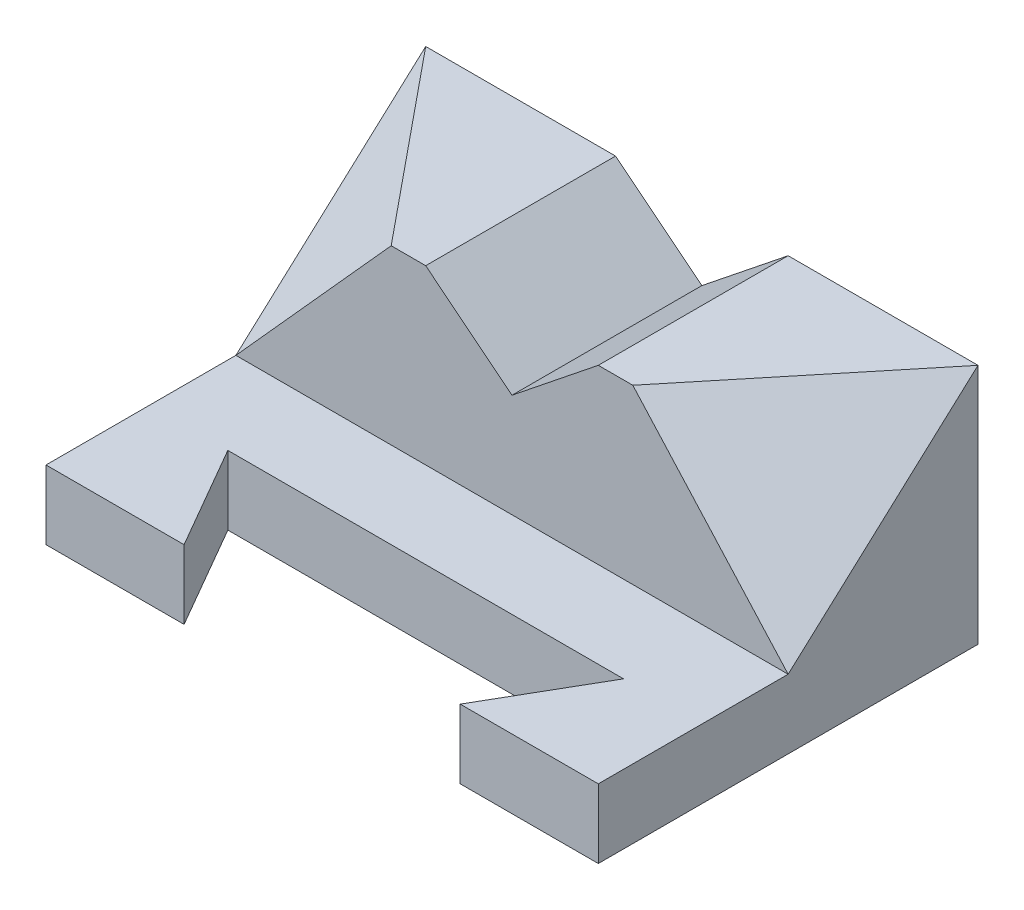
ISO-10303-21;
HEADER;
FILE_DESCRIPTION(('STEP AP214'),'2;1');
FILE_NAME('part.step','',(''),(''),'','','');
FILE_SCHEMA(('AUTOMOTIVE_DESIGN { 1 0 10303 214 1 1 1 1 }'));
ENDSEC;
DATA;
#1=APPLICATION_CONTEXT('core data for automotive mechanical design processes');
#2=APPLICATION_PROTOCOL_DEFINITION('international standard','automotive_design',2000,#1);
#3=PRODUCT_CONTEXT('',#1,'mechanical');
#4=PRODUCT('Part','Part','',(#3));
#5=PRODUCT_RELATED_PRODUCT_CATEGORY('part','',(#4));
#6=PRODUCT_DEFINITION_FORMATION('','',#4);
#7=PRODUCT_DEFINITION_CONTEXT('part definition',#1,'design');
#8=PRODUCT_DEFINITION('design','',#6,#7);
#9=PRODUCT_DEFINITION_SHAPE('','',#8);
#10=(LENGTH_UNIT() NAMED_UNIT(*) SI_UNIT(.MILLI.,.METRE.));
#11=(NAMED_UNIT(*) PLANE_ANGLE_UNIT() SI_UNIT($,.RADIAN.));
#12=(NAMED_UNIT(*) SI_UNIT($,.STERADIAN.) SOLID_ANGLE_UNIT());
#13=UNCERTAINTY_MEASURE_WITH_UNIT(LENGTH_MEASURE(1.E-05),#10,'distance_accuracy_value','');
#14=(GEOMETRIC_REPRESENTATION_CONTEXT(3) GLOBAL_UNCERTAINTY_ASSIGNED_CONTEXT((#13)) GLOBAL_UNIT_ASSIGNED_CONTEXT((#10,
#11,#12)) REPRESENTATION_CONTEXT('',''));
#15=CARTESIAN_POINT('',(0.,0.,0.));
#16=DIRECTION('',(0.,0.,1.));
#17=DIRECTION('',(1.,0.,0.));
#18=AXIS2_PLACEMENT_3D('',#15,#16,#17);
#19=CARTESIAN_POINT('',(-32.,28.,0.));
#20=DIRECTION('',(0.,0.,-1.));
#21=DIRECTION('',(-1.,0.,0.));
#22=AXIS2_PLACEMENT_3D('',#19,#20,#21);
#23=PLANE('',#22);
#24=DIRECTION('',(-0.66896473162245,-0.743294146247166,0.));
#25=VECTOR('',#24,1.);
#26=CARTESIAN_POINT('',(-14.,28.,0.));
#27=LINE('',#26,#25);
#28=CARTESIAN_POINT('',(-14.,28.,0.));
#29=VERTEX_POINT('',#28);
#30=CARTESIAN_POINT('',(-32.,8.,0.));
#31=VERTEX_POINT('',#30);
#32=EDGE_CURVE('E195',#29,#31,#27,.T.);
#33=ORIENTED_EDGE('',*,*,#32,.T.);
#34=DIRECTION('',(1.,0.,0.));
#35=VECTOR('',#34,1.);
#36=CARTESIAN_POINT('',(-32.,8.,0.));
#37=LINE('',#36,#35);
#38=CARTESIAN_POINT('',(32.,8.,0.));
#39=VERTEX_POINT('',#38);
#40=EDGE_CURVE('E222',#31,#39,#37,.T.);
#41=ORIENTED_EDGE('',*,*,#40,.T.);
#42=DIRECTION('',(0.66896473162245,-0.743294146247166,0.));
#43=VECTOR('',#42,1.);
#44=CARTESIAN_POINT('',(14.,28.,0.));
#45=LINE('',#44,#43);
#46=CARTESIAN_POINT('',(14.,28.,0.));
#47=VERTEX_POINT('',#46);
#48=EDGE_CURVE('E298',#47,#39,#45,.T.);
#49=ORIENTED_EDGE('',*,*,#48,.F.);
#50=DIRECTION('',(1.,0.,0.));
#51=VECTOR('',#50,1.);
#52=CARTESIAN_POINT('',(-32.,28.,0.));
#53=LINE('',#52,#51);
#54=CARTESIAN_POINT('',(10.,28.,0.));
#55=VERTEX_POINT('',#54);
#56=EDGE_CURVE('E215',#55,#47,#53,.T.);
#57=ORIENTED_EDGE('',*,*,#56,.F.);
#58=DIRECTION('',(-0.78086880944303,-0.624695047554424,0.));
#59=VECTOR('',#58,1.);
#60=CARTESIAN_POINT('',(-15.609756097561,7.51219512195121,0.));
#61=LINE('',#60,#59);
#62=CARTESIAN_POINT('',(0.,20.,0.));
#63=VERTEX_POINT('',#62);
#64=EDGE_CURVE('E12',#55,#63,#61,.T.);
#65=ORIENTED_EDGE('',*,*,#64,.T.);
#66=DIRECTION('',(-0.78086880944303,0.624695047554424,0.));
#67=VECTOR('',#66,1.);
#68=CARTESIAN_POINT('',(-23.4146341463415,38.7317073170732,0.));
#69=LINE('',#68,#67);
#70=CARTESIAN_POINT('',(-10.,28.,0.));
#71=VERTEX_POINT('',#70);
#72=EDGE_CURVE('E105',#63,#71,#69,.T.);
#73=ORIENTED_EDGE('',*,*,#72,.T.);
#74=EDGE_CURVE('E113',#29,#71,#53,.T.);
#75=ORIENTED_EDGE('',*,*,#74,.F.);
#76=EDGE_LOOP('',(#33,#41,#49,#57,#65,#73,#75));
#77=FACE_BOUND('',#76,.T.);
#78=ADVANCED_FACE('F95',(#77),#23,.F.);
#79=CARTESIAN_POINT('',(0.,28.,0.));
#80=DIRECTION('',(0.,1.,0.));
#81=DIRECTION('',(0.,0.,1.));
#82=AXIS2_PLACEMENT_3D('',#79,#80,#81);
#83=PLANE('',#82);
#84=DIRECTION('',(0.633237790257262,0.,0.773957299203322));
#85=VECTOR('',#84,1.);
#86=CARTESIAN_POINT('',(-32.,28.,-22.));
#87=LINE('',#86,#85);
#88=CARTESIAN_POINT('',(-32.,28.,-22.));
#89=VERTEX_POINT('',#88);
#90=EDGE_CURVE('E197',#89,#29,#87,.T.);
#91=ORIENTED_EDGE('',*,*,#90,.T.);
#92=ORIENTED_EDGE('',*,*,#74,.T.);
#93=DIRECTION('',(0.,0.,-1.));
#94=VECTOR('',#93,1.);
#95=CARTESIAN_POINT('',(-10.,28.,130.698837202751));
#96=LINE('',#95,#94);
#97=CARTESIAN_POINT('',(-10.,28.,-21.9999999999999));
#98=VERTEX_POINT('',#97);
#99=EDGE_CURVE('E297',#71,#98,#96,.T.);
#100=ORIENTED_EDGE('',*,*,#99,.T.);
#101=DIRECTION('',(-1.,0.,0.));
#102=VECTOR('',#101,1.);
#103=CARTESIAN_POINT('',(-32.,28.,-22.));
#104=LINE('',#103,#102);
#105=EDGE_CURVE('E209',#98,#89,#104,.T.);
#106=ORIENTED_EDGE('',*,*,#105,.T.);
#107=EDGE_LOOP('',(#91,#92,#100,#106));
#108=FACE_BOUND('',#107,.T.);
#109=ADVANCED_FACE('F207',(#108),#83,.T.);
#110=CARTESIAN_POINT('',(-32.,8.,22.));
#111=DIRECTION('',(0.,0.,-1.));
#112=DIRECTION('',(-1.,0.,0.));
#113=AXIS2_PLACEMENT_3D('',#110,#111,#112);
#114=PLANE('',#113);
#115=DIRECTION('',(0.,-1.,0.));
#116=VECTOR('',#115,1.);
#117=CARTESIAN_POINT('',(-16.,111.198837202751,22.));
#118=LINE('',#117,#116);
#119=CARTESIAN_POINT('',(-16.,8.,22.));
#120=VERTEX_POINT('',#119);
#121=CARTESIAN_POINT('',(-16.,0.,22.));
#122=VERTEX_POINT('',#121);
#123=EDGE_CURVE('E266',#120,#122,#118,.T.);
#124=ORIENTED_EDGE('',*,*,#123,.F.);
#125=DIRECTION('',(1.,0.,0.));
#126=VECTOR('',#125,1.);
#127=CARTESIAN_POINT('',(-32.,8.,22.));
#128=LINE('',#127,#126);
#129=CARTESIAN_POINT('',(-32.,8.,22.));
#130=VERTEX_POINT('',#129);
#131=EDGE_CURVE('E335',#130,#120,#128,.T.);
#132=ORIENTED_EDGE('',*,*,#131,.F.);
#133=DIRECTION('',(0.,-1.,0.));
#134=VECTOR('',#133,1.);
#135=CARTESIAN_POINT('',(-32.,8.,22.));
#136=LINE('',#135,#134);
#137=CARTESIAN_POINT('',(-32.,0.,22.));
#138=VERTEX_POINT('',#137);
#139=EDGE_CURVE('E330',#130,#138,#136,.T.);
#140=ORIENTED_EDGE('',*,*,#139,.T.);
#141=DIRECTION('',(1.,0.,0.));
#142=VECTOR('',#141,1.);
#143=CARTESIAN_POINT('',(-32.,0.,22.));
#144=LINE('',#143,#142);
#145=EDGE_CURVE('E256',#138,#122,#144,.T.);
#146=ORIENTED_EDGE('',*,*,#145,.T.);
#147=EDGE_LOOP('',(#124,#132,#140,#146));
#148=FACE_BOUND('',#147,.T.);
#149=ADVANCED_FACE('F408',(#148),#114,.F.);
#150=CARTESIAN_POINT('',(0.,8.,0.));
#151=DIRECTION('',(0.,-1.,0.));
#152=DIRECTION('',(0.,0.,-1.));
#153=AXIS2_PLACEMENT_3D('',#150,#151,#152);
#154=PLANE('',#153);
#155=ORIENTED_EDGE('',*,*,#131,.T.);
#156=DIRECTION('',(-0.499999999999998,0.,-0.86602540378444));
#157=VECTOR('',#156,1.);
#158=CARTESIAN_POINT('',(-21.5262794416288,8.,12.4282032302755));
#159=LINE('',#158,#157);
#160=CARTESIAN_POINT('',(-22.9282032302755,8.,10.));
#161=VERTEX_POINT('',#160);
#162=EDGE_CURVE('E121',#120,#161,#159,.T.);
#163=ORIENTED_EDGE('',*,*,#162,.T.);
#164=DIRECTION('',(1.,0.,0.));
#165=VECTOR('',#164,1.);
#166=CARTESIAN_POINT('',(0.,8.,10.));
#167=LINE('',#166,#165);
#168=CARTESIAN_POINT('',(22.9282032302755,8.,10.));
#169=VERTEX_POINT('',#168);
#170=EDGE_CURVE('E261',#161,#169,#167,.T.);
#171=ORIENTED_EDGE('',*,*,#170,.T.);
#172=DIRECTION('',(-0.499999999999998,0.,0.86602540378444));
#173=VECTOR('',#172,1.);
#174=CARTESIAN_POINT('',(21.5262794416288,8.,12.4282032302754));
#175=LINE('',#174,#173);
#176=CARTESIAN_POINT('',(16.,8.,22.));
#177=VERTEX_POINT('',#176);
#178=EDGE_CURVE('E263',#169,#177,#175,.T.);
#179=ORIENTED_EDGE('',*,*,#178,.T.);
#180=CARTESIAN_POINT('',(32.,8.,22.));
#181=VERTEX_POINT('',#180);
#182=EDGE_CURVE('E333',#177,#181,#128,.T.);
#183=ORIENTED_EDGE('',*,*,#182,.T.);
#184=DIRECTION('',(0.,0.,-1.));
#185=VECTOR('',#184,1.);
#186=CARTESIAN_POINT('',(32.,8.,22.));
#187=LINE('',#186,#185);
#188=EDGE_CURVE('E252',#181,#39,#187,.T.);
#189=ORIENTED_EDGE('',*,*,#188,.T.);
#190=ORIENTED_EDGE('',*,*,#40,.F.);
#191=DIRECTION('',(0.,0.,1.));
#192=VECTOR('',#191,1.);
#193=CARTESIAN_POINT('',(-32.,8.,22.));
#194=LINE('',#193,#192);
#195=EDGE_CURVE('E229',#31,#130,#194,.T.);
#196=ORIENTED_EDGE('',*,*,#195,.T.);
#197=EDGE_LOOP('',(#155,#163,#171,#179,#183,#189,#190,#196));
#198=FACE_BOUND('',#197,.T.);
#199=ADVANCED_FACE('F383',(#198),#154,.F.);
#200=CARTESIAN_POINT('',(32.,8.,22.));
#201=DIRECTION('',(-1.,0.,0.));
#202=DIRECTION('',(0.,0.,1.));
#203=AXIS2_PLACEMENT_3D('',#200,#201,#202);
#204=PLANE('',#203);
#205=DIRECTION('',(0.,-1.,0.));
#206=VECTOR('',#205,1.);
#207=CARTESIAN_POINT('',(32.,8.,-22.));
#208=LINE('',#207,#206);
#209=CARTESIAN_POINT('',(32.,28.,-22.));
#210=VERTEX_POINT('',#209);
#211=CARTESIAN_POINT('',(32.,0.,-22.));
#212=VERTEX_POINT('',#211);
#213=EDGE_CURVE('E240',#210,#212,#208,.T.);
#214=ORIENTED_EDGE('',*,*,#213,.F.);
#215=DIRECTION('',(0.,0.672672793996313,-0.739940073395944));
#216=VECTOR('',#215,1.);
#217=CARTESIAN_POINT('',(32.,8.,0.));
#218=LINE('',#217,#216);
#219=EDGE_CURVE('E305',#39,#210,#218,.T.);
#220=ORIENTED_EDGE('',*,*,#219,.F.);
#221=ORIENTED_EDGE('',*,*,#188,.F.);
#222=DIRECTION('',(0.,-1.,0.));
#223=VECTOR('',#222,1.);
#224=CARTESIAN_POINT('',(32.,8.,22.));
#225=LINE('',#224,#223);
#226=CARTESIAN_POINT('',(32.,0.,22.));
#227=VERTEX_POINT('',#226);
#228=EDGE_CURVE('E339',#181,#227,#225,.T.);
#229=ORIENTED_EDGE('',*,*,#228,.T.);
#230=DIRECTION('',(0.,0.,-1.));
#231=VECTOR('',#230,1.);
#232=CARTESIAN_POINT('',(32.,0.,22.));
#233=LINE('',#232,#231);
#234=EDGE_CURVE('E251',#227,#212,#233,.T.);
#235=ORIENTED_EDGE('',*,*,#234,.T.);
#236=EDGE_LOOP('',(#214,#220,#221,#229,#235));
#237=FACE_BOUND('',#236,.T.);
#238=ADVANCED_FACE('F97',(#237),#204,.F.);
#239=CARTESIAN_POINT('',(-32.,8.,-22.));
#240=DIRECTION('',(0.,0.,1.));
#241=DIRECTION('',(1.,0.,0.));
#242=AXIS2_PLACEMENT_3D('',#239,#240,#241);
#243=PLANE('',#242);
#244=DIRECTION('',(0.78086880944303,-0.624695047554424,0.));
#245=VECTOR('',#244,1.);
#246=CARTESIAN_POINT('',(-13.6585365853659,30.9268292682927,-22.));
#247=LINE('',#246,#245);
#248=CARTESIAN_POINT('',(0.,20.,-21.9999999999999));
#249=VERTEX_POINT('',#248);
#250=EDGE_CURVE('E288',#98,#249,#247,.T.);
#251=ORIENTED_EDGE('',*,*,#250,.T.);
#252=DIRECTION('',(0.78086880944303,0.624695047554424,0.));
#253=VECTOR('',#252,1.);
#254=CARTESIAN_POINT('',(-25.3658536585366,-0.292682926829272,-22.));
#255=LINE('',#254,#253);
#256=CARTESIAN_POINT('',(10.,28.,-21.9999999999999));
#257=VERTEX_POINT('',#256);
#258=EDGE_CURVE('E281',#249,#257,#255,.T.);
#259=ORIENTED_EDGE('',*,*,#258,.T.);
#260=EDGE_CURVE('E219',#210,#257,#104,.T.);
#261=ORIENTED_EDGE('',*,*,#260,.F.);
#262=ORIENTED_EDGE('',*,*,#213,.T.);
#263=DIRECTION('',(-1.,0.,0.));
#264=VECTOR('',#263,1.);
#265=CARTESIAN_POINT('',(-32.,0.,-22.));
#266=LINE('',#265,#264);
#267=CARTESIAN_POINT('',(-32.,0.,-22.));
#268=VERTEX_POINT('',#267);
#269=EDGE_CURVE('E344',#212,#268,#266,.T.);
#270=ORIENTED_EDGE('',*,*,#269,.T.);
#271=DIRECTION('',(0.,-1.,0.));
#272=VECTOR('',#271,1.);
#273=CARTESIAN_POINT('',(-32.,8.,-22.));
#274=LINE('',#273,#272);
#275=EDGE_CURVE('E245',#89,#268,#274,.T.);
#276=ORIENTED_EDGE('',*,*,#275,.F.);
#277=ORIENTED_EDGE('',*,*,#105,.F.);
#278=EDGE_LOOP('',(#251,#259,#261,#262,#270,#276,#277));
#279=FACE_BOUND('',#278,.T.);
#280=ADVANCED_FACE('F405',(#279),#243,.F.);
#281=CARTESIAN_POINT('',(-32.,8.,22.));
#282=DIRECTION('',(1.,0.,0.));
#283=DIRECTION('',(0.,0.,-1.));
#284=AXIS2_PLACEMENT_3D('',#281,#282,#283);
#285=PLANE('',#284);
#286=ORIENTED_EDGE('',*,*,#195,.F.);
#287=DIRECTION('',(0.,0.672672793996313,-0.739940073395944));
#288=VECTOR('',#287,1.);
#289=CARTESIAN_POINT('',(-32.,8.,0.));
#290=LINE('',#289,#288);
#291=EDGE_CURVE('E199',#31,#89,#290,.T.);
#292=ORIENTED_EDGE('',*,*,#291,.T.);
#293=ORIENTED_EDGE('',*,*,#275,.T.);
#294=DIRECTION('',(0.,0.,1.));
#295=VECTOR('',#294,1.);
#296=CARTESIAN_POINT('',(-32.,0.,22.));
#297=LINE('',#296,#295);
#298=EDGE_CURVE('E347',#268,#138,#297,.T.);
#299=ORIENTED_EDGE('',*,*,#298,.T.);
#300=ORIENTED_EDGE('',*,*,#139,.F.);
#301=EDGE_LOOP('',(#286,#292,#293,#299,#300));
#302=FACE_BOUND('',#301,.T.);
#303=ADVANCED_FACE('F326',(#302),#285,.F.);
#304=ORIENTED_EDGE('',*,*,#182,.F.);
#305=DIRECTION('',(0.,-1.,0.));
#306=VECTOR('',#305,1.);
#307=CARTESIAN_POINT('',(16.,111.198837202751,22.));
#308=LINE('',#307,#306);
#309=CARTESIAN_POINT('',(16.,0.,22.));
#310=VERTEX_POINT('',#309);
#311=EDGE_CURVE('E273',#177,#310,#308,.T.);
#312=ORIENTED_EDGE('',*,*,#311,.T.);
#313=EDGE_CURVE('E350',#310,#227,#144,.T.);
#314=ORIENTED_EDGE('',*,*,#313,.T.);
#315=ORIENTED_EDGE('',*,*,#228,.F.);
#316=EDGE_LOOP('',(#304,#312,#314,#315));
#317=FACE_BOUND('',#316,.T.);
#318=ADVANCED_FACE('F385',(#317),#114,.F.);
#319=CARTESIAN_POINT('',(0.,0.,0.));
#320=DIRECTION('',(0.,-1.,0.));
#321=DIRECTION('',(0.,0.,-1.));
#322=AXIS2_PLACEMENT_3D('',#319,#320,#321);
#323=PLANE('',#322);
#324=DIRECTION('',(-0.499999999999998,0.,-0.86602540378444));
#325=VECTOR('',#324,1.);
#326=CARTESIAN_POINT('',(-21.5262794416288,0.,12.4282032302755));
#327=LINE('',#326,#325);
#328=CARTESIAN_POINT('',(-22.9282032302755,0.,10.));
#329=VERTEX_POINT('',#328);
#330=EDGE_CURVE('E366',#122,#329,#327,.T.);
#331=ORIENTED_EDGE('',*,*,#330,.F.);
#332=ORIENTED_EDGE('',*,*,#145,.F.);
#333=ORIENTED_EDGE('',*,*,#298,.F.);
#334=ORIENTED_EDGE('',*,*,#269,.F.);
#335=ORIENTED_EDGE('',*,*,#234,.F.);
#336=ORIENTED_EDGE('',*,*,#313,.F.);
#337=DIRECTION('',(-0.499999999999998,0.,0.86602540378444));
#338=VECTOR('',#337,1.);
#339=CARTESIAN_POINT('',(21.5262794416288,0.,12.4282032302754));
#340=LINE('',#339,#338);
#341=CARTESIAN_POINT('',(22.9282032302755,0.,10.));
#342=VERTEX_POINT('',#341);
#343=EDGE_CURVE('E244',#342,#310,#340,.T.);
#344=ORIENTED_EDGE('',*,*,#343,.F.);
#345=DIRECTION('',(1.,0.,0.));
#346=VECTOR('',#345,1.);
#347=CARTESIAN_POINT('',(0.,0.,10.));
#348=LINE('',#347,#346);
#349=EDGE_CURVE('E362',#329,#342,#348,.T.);
#350=ORIENTED_EDGE('',*,*,#349,.F.);
#351=EDGE_LOOP('',(#331,#332,#333,#334,#335,#336,#344,#350));
#352=FACE_BOUND('',#351,.T.);
#353=ADVANCED_FACE('F406',(#352),#323,.T.);
#354=DIRECTION('',(-0.633237790257262,0.,0.773957299203322));
#355=VECTOR('',#354,1.);
#356=CARTESIAN_POINT('',(32.,28.,-22.));
#357=LINE('',#356,#355);
#358=EDGE_CURVE('E204',#210,#47,#357,.T.);
#359=ORIENTED_EDGE('',*,*,#358,.F.);
#360=ORIENTED_EDGE('',*,*,#260,.T.);
#361=DIRECTION('',(0.,0.,-1.));
#362=VECTOR('',#361,1.);
#363=CARTESIAN_POINT('',(10.,28.,130.698837202751));
#364=LINE('',#363,#362);
#365=EDGE_CURVE('E292',#55,#257,#364,.T.);
#366=ORIENTED_EDGE('',*,*,#365,.F.);
#367=ORIENTED_EDGE('',*,*,#56,.T.);
#368=EDGE_LOOP('',(#359,#360,#366,#367));
#369=FACE_BOUND('',#368,.T.);
#370=ADVANCED_FACE('F396',(#369),#83,.T.);
#371=CARTESIAN_POINT('',(-22.9282032302755,111.198837202751,10.));
#372=DIRECTION('',(-0.86602540378444,0.,0.499999999999998));
#373=DIRECTION('',(0.499999999999998,0.,0.86602540378444));
#374=AXIS2_PLACEMENT_3D('',#371,#372,#373);
#375=PLANE('',#374);
#376=ORIENTED_EDGE('',*,*,#162,.F.);
#377=ORIENTED_EDGE('',*,*,#123,.T.);
#378=ORIENTED_EDGE('',*,*,#330,.T.);
#379=DIRECTION('',(0.,-1.,0.));
#380=VECTOR('',#379,1.);
#381=CARTESIAN_POINT('',(-22.9282032302755,111.198837202751,10.));
#382=LINE('',#381,#380);
#383=EDGE_CURVE('E269',#161,#329,#382,.T.);
#384=ORIENTED_EDGE('',*,*,#383,.F.);
#385=EDGE_LOOP('',(#376,#377,#378,#384));
#386=FACE_BOUND('',#385,.T.);
#387=ADVANCED_FACE('F374',(#386),#375,.F.);
#388=CARTESIAN_POINT('',(-22.9282032302755,111.198837202751,10.));
#389=DIRECTION('',(0.,0.,-1.));
#390=DIRECTION('',(-1.,0.,0.));
#391=AXIS2_PLACEMENT_3D('',#388,#389,#390);
#392=PLANE('',#391);
#393=ORIENTED_EDGE('',*,*,#170,.F.);
#394=ORIENTED_EDGE('',*,*,#383,.T.);
#395=ORIENTED_EDGE('',*,*,#349,.T.);
#396=DIRECTION('',(0.,-1.,0.));
#397=VECTOR('',#396,1.);
#398=CARTESIAN_POINT('',(22.9282032302755,111.198837202751,10.));
#399=LINE('',#398,#397);
#400=EDGE_CURVE('E277',#169,#342,#399,.T.);
#401=ORIENTED_EDGE('',*,*,#400,.F.);
#402=EDGE_LOOP('',(#393,#394,#395,#401));
#403=FACE_BOUND('',#402,.T.);
#404=ADVANCED_FACE('F378',(#403),#392,.F.);
#405=CARTESIAN_POINT('',(22.9282032302755,111.198837202751,10.));
#406=DIRECTION('',(0.86602540378444,0.,0.499999999999998));
#407=DIRECTION('',(0.499999999999998,0.,-0.86602540378444));
#408=AXIS2_PLACEMENT_3D('',#405,#406,#407);
#409=PLANE('',#408);
#410=ORIENTED_EDGE('',*,*,#178,.F.);
#411=ORIENTED_EDGE('',*,*,#400,.T.);
#412=ORIENTED_EDGE('',*,*,#343,.T.);
#413=ORIENTED_EDGE('',*,*,#311,.F.);
#414=EDGE_LOOP('',(#410,#411,#412,#413));
#415=FACE_BOUND('',#414,.T.);
#416=ADVANCED_FACE('F381',(#415),#409,.F.);
#417=CARTESIAN_POINT('',(0.,20.,130.698837202751));
#418=DIRECTION('',(0.624695047554424,-0.78086880944303,0.));
#419=DIRECTION('',(0.78086880944303,0.624695047554424,0.));
#420=AXIS2_PLACEMENT_3D('',#417,#418,#419);
#421=PLANE('',#420);
#422=ORIENTED_EDGE('',*,*,#258,.F.);
#423=DIRECTION('',(0.,0.,-1.));
#424=VECTOR('',#423,1.);
#425=CARTESIAN_POINT('',(0.,20.,130.698837202751));
#426=LINE('',#425,#424);
#427=EDGE_CURVE('E293',#63,#249,#426,.T.);
#428=ORIENTED_EDGE('',*,*,#427,.F.);
#429=ORIENTED_EDGE('',*,*,#64,.F.);
#430=ORIENTED_EDGE('',*,*,#365,.T.);
#431=EDGE_LOOP('',(#422,#428,#429,#430));
#432=FACE_BOUND('',#431,.T.);
#433=ADVANCED_FACE('F401',(#432),#421,.F.);
#434=CARTESIAN_POINT('',(0.,20.,130.698837202751));
#435=DIRECTION('',(-0.624695047554424,-0.78086880944303,0.));
#436=DIRECTION('',(0.78086880944303,-0.624695047554424,0.));
#437=AXIS2_PLACEMENT_3D('',#434,#435,#436);
#438=PLANE('',#437);
#439=ORIENTED_EDGE('',*,*,#250,.F.);
#440=ORIENTED_EDGE('',*,*,#99,.F.);
#441=ORIENTED_EDGE('',*,*,#72,.F.);
#442=ORIENTED_EDGE('',*,*,#427,.T.);
#443=EDGE_LOOP('',(#439,#440,#441,#442));
#444=FACE_BOUND('',#443,.T.);
#445=ADVANCED_FACE('F403',(#444),#438,.F.);
#446=CARTESIAN_POINT('',(15.8101396620113,14.2291256958101,12.9355688143729));
#447=DIRECTION('',(-0.635074711618265,-0.571567240456438,-0.519606582233126));
#448=DIRECTION('',(0.668964731622449,-0.743294146247167,0.));
#449=AXIS2_PLACEMENT_3D('',#446,#447,#448);
#450=PLANE('',#449);
#451=ORIENTED_EDGE('',*,*,#48,.T.);
#452=ORIENTED_EDGE('',*,*,#219,.T.);
#453=ORIENTED_EDGE('',*,*,#358,.T.);
#454=EDGE_LOOP('',(#451,#452,#453));
#455=FACE_BOUND('',#454,.T.);
#456=ADVANCED_FACE('F394',(#455),#450,.F.);
#457=CARTESIAN_POINT('',(-15.8101396620113,14.2291256958101,12.9355688143729));
#458=DIRECTION('',(0.635074711618265,-0.571567240456438,-0.519606582233126));
#459=DIRECTION('',(0.66896473162245,0.743294146247166,0.));
#460=AXIS2_PLACEMENT_3D('',#457,#458,#459);
#461=PLANE('',#460);
#462=ORIENTED_EDGE('',*,*,#90,.F.);
#463=ORIENTED_EDGE('',*,*,#291,.F.);
#464=ORIENTED_EDGE('',*,*,#32,.F.);
#465=EDGE_LOOP('',(#462,#463,#464));
#466=FACE_BOUND('',#465,.T.);
#467=ADVANCED_FACE('F196',(#466),#461,.F.);
#468=CLOSED_SHELL('',(#78,#109,#149,#199,#238,#280,#303,#318,#353,#370,#387,#404,#416,#433,#445,
#456,#467));
#469=MANIFOLD_SOLID_BREP('B2',#468);
#470=ADVANCED_BREP_SHAPE_REPRESENTATION('',(#18,#469),#14);
#471=SHAPE_DEFINITION_REPRESENTATION(#9,#470);
ENDSEC;
END-ISO-10303-21;
